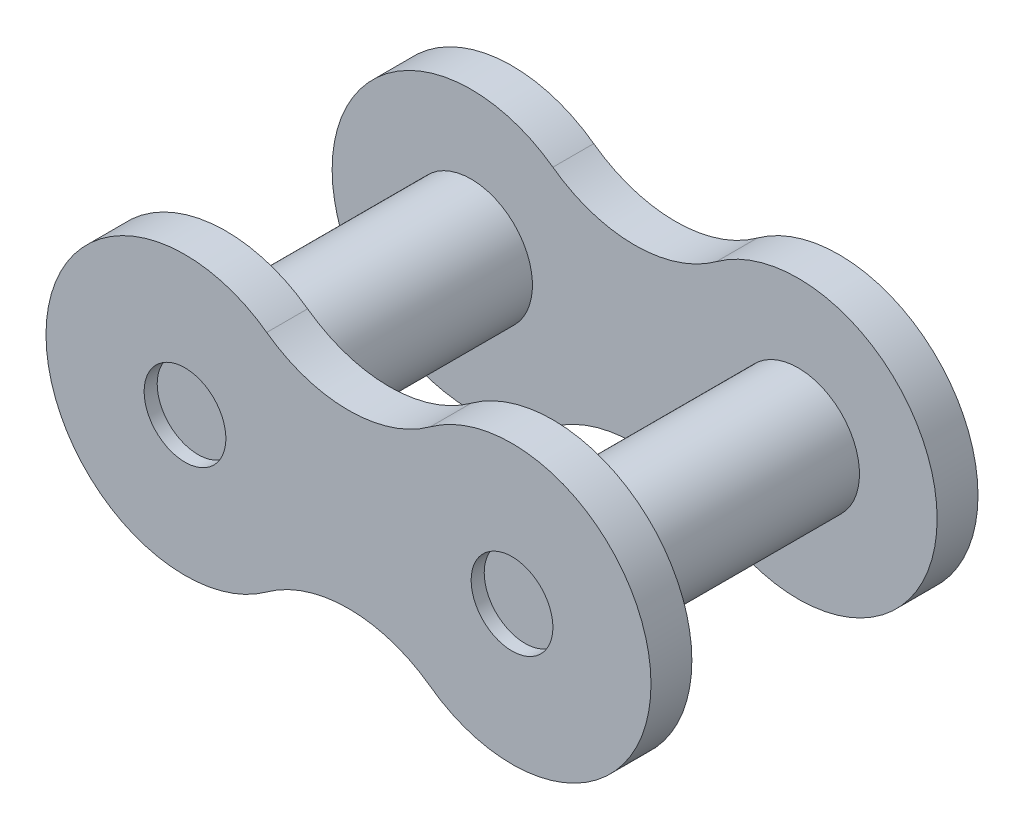
ISO-10303-21;
HEADER;
FILE_DESCRIPTION(('STEP AP214'),'2;1');
FILE_NAME('part.step','',(''),(''),'','','');
FILE_SCHEMA(('AUTOMOTIVE_DESIGN { 1 0 10303 214 1 1 1 1 }'));
ENDSEC;
DATA;
#1=APPLICATION_CONTEXT('core data for automotive mechanical design processes');
#2=APPLICATION_PROTOCOL_DEFINITION('international standard','automotive_design',2000,#1);
#3=PRODUCT_CONTEXT('',#1,'mechanical');
#4=PRODUCT('Part','Part','',(#3));
#5=PRODUCT_RELATED_PRODUCT_CATEGORY('part','',(#4));
#6=PRODUCT_DEFINITION_FORMATION('','',#4);
#7=PRODUCT_DEFINITION_CONTEXT('part definition',#1,'design');
#8=PRODUCT_DEFINITION('design','',#6,#7);
#9=PRODUCT_DEFINITION_SHAPE('','',#8);
#10=(LENGTH_UNIT() NAMED_UNIT(*) SI_UNIT(.MILLI.,.METRE.));
#11=(NAMED_UNIT(*) PLANE_ANGLE_UNIT() SI_UNIT($,.RADIAN.));
#12=(NAMED_UNIT(*) SI_UNIT($,.STERADIAN.) SOLID_ANGLE_UNIT());
#13=UNCERTAINTY_MEASURE_WITH_UNIT(LENGTH_MEASURE(1.E-05),#10,'distance_accuracy_value','');
#14=(GEOMETRIC_REPRESENTATION_CONTEXT(3) GLOBAL_UNCERTAINTY_ASSIGNED_CONTEXT((#13)) GLOBAL_UNIT_ASSIGNED_CONTEXT((#10,
#11,#12)) REPRESENTATION_CONTEXT('',''));
#15=CARTESIAN_POINT('',(0.,0.,0.));
#16=DIRECTION('',(0.,0.,1.));
#17=DIRECTION('',(1.,0.,0.));
#18=AXIS2_PLACEMENT_3D('',#15,#16,#17);
#19=CARTESIAN_POINT('',(9.525,-4.36490334944544,-0.79375));
#20=DIRECTION('',(0.,0.,1.));
#21=DIRECTION('',(1.,0.,0.));
#22=AXIS2_PLACEMENT_3D('',#19,#20,#21);
#23=CYLINDRICAL_SURFACE('',#22,2.69875);
#24=CARTESIAN_POINT('',(9.525,-4.36490334944544,0.));
#25=DIRECTION('',(0.,0.,-1.));
#26=DIRECTION('',(-1.,0.,0.));
#27=AXIS2_PLACEMENT_3D('',#24,#25,#26);
#28=CIRCLE('',#27,2.69875);
#29=CARTESIAN_POINT('',(11.1125,-2.18245167472272,0.));
#30=VERTEX_POINT('',#29);
#31=CARTESIAN_POINT('',(7.9375,-2.18245167472272,0.));
#32=VERTEX_POINT('',#31);
#33=EDGE_CURVE('E162',#30,#32,#28,.F.);
#34=ORIENTED_EDGE('',*,*,#33,.T.);
#35=DIRECTION('',(0.,0.,1.));
#36=VECTOR('',#35,1.);
#37=CARTESIAN_POINT('',(7.9375,-2.18245167472272,-0.79375));
#38=LINE('',#37,#36);
#39=CARTESIAN_POINT('',(7.9375,-2.18245167472272,-0.79375));
#40=VERTEX_POINT('',#39);
#41=EDGE_CURVE('E11',#40,#32,#38,.T.);
#42=ORIENTED_EDGE('',*,*,#41,.F.);
#43=CARTESIAN_POINT('',(9.525,-4.36490334944544,-0.79375));
#44=DIRECTION('',(0.,0.,-1.));
#45=DIRECTION('',(-1.,0.,0.));
#46=AXIS2_PLACEMENT_3D('',#43,#44,#45);
#47=CIRCLE('',#46,2.69875);
#48=CARTESIAN_POINT('',(11.1125,-2.18245167472272,-0.79375));
#49=VERTEX_POINT('',#48);
#50=EDGE_CURVE('E163',#49,#40,#47,.F.);
#51=ORIENTED_EDGE('',*,*,#50,.F.);
#52=DIRECTION('',(0.,0.,1.));
#53=VECTOR('',#52,1.);
#54=CARTESIAN_POINT('',(11.1125,-2.18245167472272,-0.79375));
#55=LINE('',#54,#53);
#56=EDGE_CURVE('E171',#49,#30,#55,.T.);
#57=ORIENTED_EDGE('',*,*,#56,.T.);
#58=EDGE_LOOP('',(#34,#42,#51,#57));
#59=FACE_BOUND('',#58,.T.);
#60=ADVANCED_FACE('F41',(#59),#23,.F.);
#61=CARTESIAN_POINT('',(6.35,0.,-0.79375));
#62=DIRECTION('',(0.,0.,1.));
#63=DIRECTION('',(1.,0.,0.));
#64=AXIS2_PLACEMENT_3D('',#61,#62,#63);
#65=CYLINDRICAL_SURFACE('',#64,2.69875);
#66=CARTESIAN_POINT('',(6.35,0.,0.));
#67=DIRECTION('',(0.,0.,-1.));
#68=DIRECTION('',(-1.,0.,0.));
#69=AXIS2_PLACEMENT_3D('',#66,#67,#68);
#70=CIRCLE('',#69,2.69875);
#71=CARTESIAN_POINT('',(7.9375,2.18245167472272,0.));
#72=VERTEX_POINT('',#71);
#73=EDGE_CURVE('E174',#32,#72,#70,.T.);
#74=ORIENTED_EDGE('',*,*,#73,.T.);
#75=DIRECTION('',(0.,0.,1.));
#76=VECTOR('',#75,1.);
#77=CARTESIAN_POINT('',(7.9375,2.18245167472272,-0.79375));
#78=LINE('',#77,#76);
#79=CARTESIAN_POINT('',(7.9375,2.18245167472272,-0.79375));
#80=VERTEX_POINT('',#79);
#81=EDGE_CURVE('E49',#80,#72,#78,.T.);
#82=ORIENTED_EDGE('',*,*,#81,.F.);
#83=CARTESIAN_POINT('',(6.35,0.,-0.79375));
#84=DIRECTION('',(0.,0.,-1.));
#85=DIRECTION('',(-1.,0.,0.));
#86=AXIS2_PLACEMENT_3D('',#83,#84,#85);
#87=CIRCLE('',#86,2.69875);
#88=EDGE_CURVE('E84',#40,#80,#87,.T.);
#89=ORIENTED_EDGE('',*,*,#88,.F.);
#90=ORIENTED_EDGE('',*,*,#41,.T.);
#91=EDGE_LOOP('',(#74,#82,#89,#90));
#92=FACE_BOUND('',#91,.T.);
#93=ADVANCED_FACE('F187',(#92),#65,.T.);
#94=CARTESIAN_POINT('',(9.525,4.36490334944544,-0.79375));
#95=DIRECTION('',(0.,0.,1.));
#96=DIRECTION('',(1.,0.,0.));
#97=AXIS2_PLACEMENT_3D('',#94,#95,#96);
#98=CYLINDRICAL_SURFACE('',#97,2.69875);
#99=CARTESIAN_POINT('',(9.525,4.36490334944544,0.));
#100=DIRECTION('',(0.,0.,-1.));
#101=DIRECTION('',(-1.,0.,0.));
#102=AXIS2_PLACEMENT_3D('',#99,#100,#101);
#103=CIRCLE('',#102,2.69875);
#104=CARTESIAN_POINT('',(11.1125,2.18245167472272,0.));
#105=VERTEX_POINT('',#104);
#106=EDGE_CURVE('E177',#105,#72,#103,.T.);
#107=ORIENTED_EDGE('',*,*,#106,.F.);
#108=DIRECTION('',(0.,0.,1.));
#109=VECTOR('',#108,1.);
#110=CARTESIAN_POINT('',(11.1125,2.18245167472272,-0.79375));
#111=LINE('',#110,#109);
#112=CARTESIAN_POINT('',(11.1125,2.18245167472272,-0.79375));
#113=VERTEX_POINT('',#112);
#114=EDGE_CURVE('E74',#113,#105,#111,.T.);
#115=ORIENTED_EDGE('',*,*,#114,.F.);
#116=CARTESIAN_POINT('',(9.525,4.36490334944544,-0.79375));
#117=DIRECTION('',(0.,0.,-1.));
#118=DIRECTION('',(-1.,0.,0.));
#119=AXIS2_PLACEMENT_3D('',#116,#117,#118);
#120=CIRCLE('',#119,2.69875);
#121=EDGE_CURVE('E167',#113,#80,#120,.T.);
#122=ORIENTED_EDGE('',*,*,#121,.T.);
#123=ORIENTED_EDGE('',*,*,#81,.T.);
#124=EDGE_LOOP('',(#107,#115,#122,#123));
#125=FACE_BOUND('',#124,.T.);
#126=ADVANCED_FACE('F186',(#125),#98,.F.);
#127=CARTESIAN_POINT('',(12.7,0.,-0.79375));
#128=DIRECTION('',(0.,0.,1.));
#129=DIRECTION('',(1.,0.,0.));
#130=AXIS2_PLACEMENT_3D('',#127,#128,#129);
#131=CYLINDRICAL_SURFACE('',#130,2.69875);
#132=CARTESIAN_POINT('',(12.7,0.,0.));
#133=DIRECTION('',(0.,0.,-1.));
#134=DIRECTION('',(-1.,0.,0.));
#135=AXIS2_PLACEMENT_3D('',#132,#133,#134);
#136=CIRCLE('',#135,2.69875);
#137=EDGE_CURVE('E77',#105,#30,#136,.T.);
#138=ORIENTED_EDGE('',*,*,#137,.T.);
#139=ORIENTED_EDGE('',*,*,#56,.F.);
#140=CARTESIAN_POINT('',(12.7,0.,-0.79375));
#141=DIRECTION('',(0.,0.,-1.));
#142=DIRECTION('',(-1.,0.,0.));
#143=AXIS2_PLACEMENT_3D('',#140,#141,#142);
#144=CIRCLE('',#143,2.69875);
#145=EDGE_CURVE('E57',#113,#49,#144,.T.);
#146=ORIENTED_EDGE('',*,*,#145,.F.);
#147=ORIENTED_EDGE('',*,*,#114,.T.);
#148=EDGE_LOOP('',(#138,#139,#146,#147));
#149=FACE_BOUND('',#148,.T.);
#150=ADVANCED_FACE('F195',(#149),#131,.T.);
#151=CARTESIAN_POINT('',(0.,0.,-0.79375));
#152=DIRECTION('',(0.,0.,-1.));
#153=DIRECTION('',(-1.,0.,0.));
#154=AXIS2_PLACEMENT_3D('',#151,#152,#153);
#155=PLANE('',#154);
#156=CARTESIAN_POINT('',(12.7,0.,-0.79375));
#157=DIRECTION('',(0.,0.,-1.));
#158=DIRECTION('',(-1.,0.,0.));
#159=AXIS2_PLACEMENT_3D('',#156,#157,#158);
#160=CIRCLE('',#159,0.793749999999999);
#161=CARTESIAN_POINT('',(11.90625,0.,-0.79375));
#162=VERTEX_POINT('',#161);
#163=EDGE_CURVE('E486',#162,#162,#160,.T.);
#164=ORIENTED_EDGE('',*,*,#163,.F.);
#165=EDGE_LOOP('',(#164));
#166=FACE_BOUND('',#165,.T.);
#167=CARTESIAN_POINT('',(6.35,0.,-0.79375));
#168=DIRECTION('',(0.,0.,-1.));
#169=DIRECTION('',(-1.,0.,0.));
#170=AXIS2_PLACEMENT_3D('',#167,#168,#169);
#171=CIRCLE('',#170,0.79375);
#172=CARTESIAN_POINT('',(5.55625,0.,-0.79375));
#173=VERTEX_POINT('',#172);
#174=EDGE_CURVE('E469',#173,#173,#171,.T.);
#175=ORIENTED_EDGE('',*,*,#174,.F.);
#176=EDGE_LOOP('',(#175));
#177=FACE_BOUND('',#176,.T.);
#178=ORIENTED_EDGE('',*,*,#50,.T.);
#179=ORIENTED_EDGE('',*,*,#88,.T.);
#180=ORIENTED_EDGE('',*,*,#121,.F.);
#181=ORIENTED_EDGE('',*,*,#145,.T.);
#182=EDGE_LOOP('',(#178,#179,#180,#181));
#183=FACE_BOUND('',#182,.T.);
#184=ADVANCED_FACE('F196',(#166,#177,#183),#155,.T.);
#185=CARTESIAN_POINT('',(0.,0.,0.));
#186=DIRECTION('',(0.,0.,-1.));
#187=DIRECTION('',(-1.,0.,0.));
#188=AXIS2_PLACEMENT_3D('',#185,#186,#187);
#189=PLANE('',#188);
#190=ORIENTED_EDGE('',*,*,#33,.F.);
#191=ORIENTED_EDGE('',*,*,#137,.F.);
#192=ORIENTED_EDGE('',*,*,#106,.T.);
#193=ORIENTED_EDGE('',*,*,#73,.F.);
#194=EDGE_LOOP('',(#190,#191,#192,#193));
#195=FACE_BOUND('',#194,.T.);
#196=CARTESIAN_POINT('',(12.7,0.,0.));
#197=DIRECTION('',(0.,0.,-1.));
#198=DIRECTION('',(-1.,0.,0.));
#199=AXIS2_PLACEMENT_3D('',#196,#197,#198);
#200=CIRCLE('',#199,1.190625);
#201=CARTESIAN_POINT('',(11.509375,0.,0.));
#202=VERTEX_POINT('',#201);
#203=EDGE_CURVE('E131',#202,#202,#200,.T.);
#204=ORIENTED_EDGE('',*,*,#203,.T.);
#205=EDGE_LOOP('',(#204));
#206=FACE_BOUND('',#205,.T.);
#207=CARTESIAN_POINT('',(6.35,0.,0.));
#208=DIRECTION('',(0.,0.,-1.));
#209=DIRECTION('',(-1.,0.,0.));
#210=AXIS2_PLACEMENT_3D('',#207,#208,#209);
#211=CIRCLE('',#210,1.190625);
#212=CARTESIAN_POINT('',(5.159375,0.,0.));
#213=VERTEX_POINT('',#212);
#214=EDGE_CURVE('E165',#213,#213,#211,.F.);
#215=ORIENTED_EDGE('',*,*,#214,.F.);
#216=EDGE_LOOP('',(#215));
#217=FACE_BOUND('',#216,.T.);
#218=ADVANCED_FACE('F191',(#195,#206,#217),#189,.F.);
#219=CARTESIAN_POINT('',(6.35,0.,2.38125));
#220=DIRECTION('',(0.,0.,-1.));
#221=DIRECTION('',(-1.,0.,0.));
#222=AXIS2_PLACEMENT_3D('',#219,#220,#221);
#223=CYLINDRICAL_SURFACE('',#222,1.190625);
#224=ORIENTED_EDGE('',*,*,#214,.T.);
#225=EDGE_LOOP('',(#224));
#226=FACE_BOUND('',#225,.T.);
#227=CARTESIAN_POINT('',(6.35,0.,4.7625));
#228=DIRECTION('',(0.,0.,-1.));
#229=DIRECTION('',(-1.,0.,0.));
#230=AXIS2_PLACEMENT_3D('',#227,#228,#229);
#231=CIRCLE('',#230,1.190625);
#232=CARTESIAN_POINT('',(5.159375,0.,4.7625));
#233=VERTEX_POINT('',#232);
#234=EDGE_CURVE('E137',#233,#233,#231,.F.);
#235=ORIENTED_EDGE('',*,*,#234,.F.);
#236=EDGE_LOOP('',(#235));
#237=FACE_BOUND('',#236,.T.);
#238=ADVANCED_FACE('F205',(#226,#237),#223,.T.);
#239=CARTESIAN_POINT('',(12.7,0.,2.38125));
#240=DIRECTION('',(0.,0.,-1.));
#241=DIRECTION('',(-1.,0.,0.));
#242=AXIS2_PLACEMENT_3D('',#239,#240,#241);
#243=CYLINDRICAL_SURFACE('',#242,1.190625);
#244=ORIENTED_EDGE('',*,*,#203,.F.);
#245=EDGE_LOOP('',(#244));
#246=FACE_BOUND('',#245,.T.);
#247=CARTESIAN_POINT('',(12.7,0.,4.7625));
#248=DIRECTION('',(0.,0.,-1.));
#249=DIRECTION('',(-1.,0.,0.));
#250=AXIS2_PLACEMENT_3D('',#247,#248,#249);
#251=CIRCLE('',#250,1.190625);
#252=CARTESIAN_POINT('',(11.509375,0.,4.7625));
#253=VERTEX_POINT('',#252);
#254=EDGE_CURVE('E143',#253,#253,#251,.T.);
#255=ORIENTED_EDGE('',*,*,#254,.T.);
#256=EDGE_LOOP('',(#255));
#257=FACE_BOUND('',#256,.T.);
#258=ADVANCED_FACE('F255',(#246,#257),#243,.T.);
#259=CARTESIAN_POINT('',(9.525,-4.36490334944544,5.55625));
#260=DIRECTION('',(0.,0.,-1.));
#261=DIRECTION('',(1.,0.,0.));
#262=AXIS2_PLACEMENT_3D('',#259,#260,#261);
#263=CYLINDRICAL_SURFACE('',#262,2.69875);
#264=CARTESIAN_POINT('',(9.525,-4.36490334944544,4.7625));
#265=DIRECTION('',(0.,0.,-1.));
#266=DIRECTION('',(-1.,0.,0.));
#267=AXIS2_PLACEMENT_3D('',#264,#265,#266);
#268=CIRCLE('',#267,2.69875);
#269=CARTESIAN_POINT('',(11.1125,-2.18245167472272,4.7625));
#270=VERTEX_POINT('',#269);
#271=CARTESIAN_POINT('',(7.9375,-2.18245167472272,4.7625));
#272=VERTEX_POINT('',#271);
#273=EDGE_CURVE('E149',#270,#272,#268,.F.);
#274=ORIENTED_EDGE('',*,*,#273,.F.);
#275=DIRECTION('',(0.,0.,-1.));
#276=VECTOR('',#275,1.);
#277=CARTESIAN_POINT('',(11.1125,-2.18245167472272,5.55625));
#278=LINE('',#277,#276);
#279=CARTESIAN_POINT('',(11.1125,-2.18245167472272,5.55625));
#280=VERTEX_POINT('',#279);
#281=EDGE_CURVE('E136',#280,#270,#278,.T.);
#282=ORIENTED_EDGE('',*,*,#281,.F.);
#283=CARTESIAN_POINT('',(9.525,-4.36490334944544,5.55625));
#284=DIRECTION('',(0.,0.,-1.));
#285=DIRECTION('',(-1.,0.,0.));
#286=AXIS2_PLACEMENT_3D('',#283,#284,#285);
#287=CIRCLE('',#286,2.69875);
#288=CARTESIAN_POINT('',(7.9375,-2.18245167472272,5.55625));
#289=VERTEX_POINT('',#288);
#290=EDGE_CURVE('E115',#280,#289,#287,.F.);
#291=ORIENTED_EDGE('',*,*,#290,.T.);
#292=DIRECTION('',(0.,0.,-1.));
#293=VECTOR('',#292,1.);
#294=CARTESIAN_POINT('',(7.9375,-2.18245167472272,5.55625));
#295=LINE('',#294,#293);
#296=EDGE_CURVE('E124',#289,#272,#295,.T.);
#297=ORIENTED_EDGE('',*,*,#296,.T.);
#298=EDGE_LOOP('',(#274,#282,#291,#297));
#299=FACE_BOUND('',#298,.T.);
#300=ADVANCED_FACE('F134',(#299),#263,.F.);
#301=CARTESIAN_POINT('',(6.35,0.,5.55625));
#302=DIRECTION('',(0.,0.,-1.));
#303=DIRECTION('',(1.,0.,0.));
#304=AXIS2_PLACEMENT_3D('',#301,#302,#303);
#305=CYLINDRICAL_SURFACE('',#304,2.69875);
#306=CARTESIAN_POINT('',(6.35,0.,4.7625));
#307=DIRECTION('',(0.,0.,-1.));
#308=DIRECTION('',(-1.,0.,0.));
#309=AXIS2_PLACEMENT_3D('',#306,#307,#308);
#310=CIRCLE('',#309,2.69875);
#311=CARTESIAN_POINT('',(7.9375,2.18245167472272,4.7625));
#312=VERTEX_POINT('',#311);
#313=EDGE_CURVE('E127',#272,#312,#310,.T.);
#314=ORIENTED_EDGE('',*,*,#313,.F.);
#315=ORIENTED_EDGE('',*,*,#296,.F.);
#316=CARTESIAN_POINT('',(6.35,0.,5.55625));
#317=DIRECTION('',(0.,0.,-1.));
#318=DIRECTION('',(-1.,0.,0.));
#319=AXIS2_PLACEMENT_3D('',#316,#317,#318);
#320=CIRCLE('',#319,2.69875);
#321=CARTESIAN_POINT('',(7.9375,2.18245167472272,5.55625));
#322=VERTEX_POINT('',#321);
#323=EDGE_CURVE('E111',#289,#322,#320,.T.);
#324=ORIENTED_EDGE('',*,*,#323,.T.);
#325=DIRECTION('',(0.,0.,-1.));
#326=VECTOR('',#325,1.);
#327=CARTESIAN_POINT('',(7.9375,2.18245167472272,5.55625));
#328=LINE('',#327,#326);
#329=EDGE_CURVE('E132',#322,#312,#328,.T.);
#330=ORIENTED_EDGE('',*,*,#329,.T.);
#331=EDGE_LOOP('',(#314,#315,#324,#330));
#332=FACE_BOUND('',#331,.T.);
#333=ADVANCED_FACE('F125',(#332),#305,.T.);
#334=CARTESIAN_POINT('',(9.525,4.36490334944544,5.55625));
#335=DIRECTION('',(0.,0.,-1.));
#336=DIRECTION('',(1.,0.,0.));
#337=AXIS2_PLACEMENT_3D('',#334,#335,#336);
#338=CYLINDRICAL_SURFACE('',#337,2.69875);
#339=CARTESIAN_POINT('',(9.525,4.36490334944544,4.7625));
#340=DIRECTION('',(0.,0.,-1.));
#341=DIRECTION('',(-1.,0.,0.));
#342=AXIS2_PLACEMENT_3D('',#339,#340,#341);
#343=CIRCLE('',#342,2.69875);
#344=CARTESIAN_POINT('',(11.1125,2.18245167472272,4.7625));
#345=VERTEX_POINT('',#344);
#346=EDGE_CURVE('E152',#345,#312,#343,.T.);
#347=ORIENTED_EDGE('',*,*,#346,.T.);
#348=ORIENTED_EDGE('',*,*,#329,.F.);
#349=CARTESIAN_POINT('',(9.525,4.36490334944544,5.55625));
#350=DIRECTION('',(0.,0.,-1.));
#351=DIRECTION('',(-1.,0.,0.));
#352=AXIS2_PLACEMENT_3D('',#349,#350,#351);
#353=CIRCLE('',#352,2.69875);
#354=CARTESIAN_POINT('',(11.1125,2.18245167472272,5.55625));
#355=VERTEX_POINT('',#354);
#356=EDGE_CURVE('E118',#355,#322,#353,.T.);
#357=ORIENTED_EDGE('',*,*,#356,.F.);
#358=DIRECTION('',(0.,0.,-1.));
#359=VECTOR('',#358,1.);
#360=CARTESIAN_POINT('',(11.1125,2.18245167472272,5.55625));
#361=LINE('',#360,#359);
#362=EDGE_CURVE('E156',#355,#345,#361,.T.);
#363=ORIENTED_EDGE('',*,*,#362,.T.);
#364=EDGE_LOOP('',(#347,#348,#357,#363));
#365=FACE_BOUND('',#364,.T.);
#366=ADVANCED_FACE('F286',(#365),#338,.F.);
#367=CARTESIAN_POINT('',(12.7,0.,5.55625));
#368=DIRECTION('',(0.,0.,-1.));
#369=DIRECTION('',(1.,0.,0.));
#370=AXIS2_PLACEMENT_3D('',#367,#368,#369);
#371=CYLINDRICAL_SURFACE('',#370,2.69875);
#372=CARTESIAN_POINT('',(12.7,0.,4.7625));
#373=DIRECTION('',(0.,0.,-1.));
#374=DIRECTION('',(-1.,0.,0.));
#375=AXIS2_PLACEMENT_3D('',#372,#373,#374);
#376=CIRCLE('',#375,2.69875);
#377=EDGE_CURVE('E140',#345,#270,#376,.T.);
#378=ORIENTED_EDGE('',*,*,#377,.F.);
#379=ORIENTED_EDGE('',*,*,#362,.F.);
#380=CARTESIAN_POINT('',(12.7,0.,5.55625));
#381=DIRECTION('',(0.,0.,-1.));
#382=DIRECTION('',(-1.,0.,0.));
#383=AXIS2_PLACEMENT_3D('',#380,#381,#382);
#384=CIRCLE('',#383,2.69875);
#385=EDGE_CURVE('E147',#355,#280,#384,.T.);
#386=ORIENTED_EDGE('',*,*,#385,.T.);
#387=ORIENTED_EDGE('',*,*,#281,.T.);
#388=EDGE_LOOP('',(#378,#379,#386,#387));
#389=FACE_BOUND('',#388,.T.);
#390=ADVANCED_FACE('F296',(#389),#371,.T.);
#391=CARTESIAN_POINT('',(0.,0.,5.55625));
#392=DIRECTION('',(0.,0.,1.));
#393=DIRECTION('',(-1.,0.,0.));
#394=AXIS2_PLACEMENT_3D('',#391,#392,#393);
#395=PLANE('',#394);
#396=CARTESIAN_POINT('',(12.7,0.,5.55625));
#397=DIRECTION('',(0.,0.,-1.));
#398=DIRECTION('',(-1.,0.,0.));
#399=AXIS2_PLACEMENT_3D('',#396,#397,#398);
#400=CIRCLE('',#399,0.793749999999999);
#401=CARTESIAN_POINT('',(11.90625,0.,5.55625));
#402=VERTEX_POINT('',#401);
#403=EDGE_CURVE('E470',#402,#402,#400,.T.);
#404=ORIENTED_EDGE('',*,*,#403,.T.);
#405=EDGE_LOOP('',(#404));
#406=FACE_BOUND('',#405,.T.);
#407=CARTESIAN_POINT('',(6.35,0.,5.55625));
#408=DIRECTION('',(0.,0.,-1.));
#409=DIRECTION('',(-1.,0.,0.));
#410=AXIS2_PLACEMENT_3D('',#407,#408,#409);
#411=CIRCLE('',#410,0.79375);
#412=CARTESIAN_POINT('',(5.55625,0.,5.55625));
#413=VERTEX_POINT('',#412);
#414=EDGE_CURVE('E480',#413,#413,#411,.T.);
#415=ORIENTED_EDGE('',*,*,#414,.T.);
#416=EDGE_LOOP('',(#415));
#417=FACE_BOUND('',#416,.T.);
#418=ORIENTED_EDGE('',*,*,#290,.F.);
#419=ORIENTED_EDGE('',*,*,#385,.F.);
#420=ORIENTED_EDGE('',*,*,#356,.T.);
#421=ORIENTED_EDGE('',*,*,#323,.F.);
#422=EDGE_LOOP('',(#418,#419,#420,#421));
#423=FACE_BOUND('',#422,.T.);
#424=ADVANCED_FACE('F113',(#406,#417,#423),#395,.T.);
#425=CARTESIAN_POINT('',(0.,0.,4.7625));
#426=DIRECTION('',(0.,0.,1.));
#427=DIRECTION('',(-1.,0.,0.));
#428=AXIS2_PLACEMENT_3D('',#425,#426,#427);
#429=PLANE('',#428);
#430=ORIENTED_EDGE('',*,*,#273,.T.);
#431=ORIENTED_EDGE('',*,*,#313,.T.);
#432=ORIENTED_EDGE('',*,*,#346,.F.);
#433=ORIENTED_EDGE('',*,*,#377,.T.);
#434=EDGE_LOOP('',(#430,#431,#432,#433));
#435=FACE_BOUND('',#434,.T.);
#436=ORIENTED_EDGE('',*,*,#254,.F.);
#437=EDGE_LOOP('',(#436));
#438=FACE_BOUND('',#437,.T.);
#439=ORIENTED_EDGE('',*,*,#234,.T.);
#440=EDGE_LOOP('',(#439));
#441=FACE_BOUND('',#440,.T.);
#442=ADVANCED_FACE('F317',(#435,#438,#441),#429,.F.);
#443=CARTESIAN_POINT('',(6.35,0.,-0.53975));
#444=DIRECTION('',(0.,0.,-1.));
#445=DIRECTION('',(-1.,0.,0.));
#446=AXIS2_PLACEMENT_3D('',#443,#444,#445);
#447=CYLINDRICAL_SURFACE('',#446,0.79375);
#448=CARTESIAN_POINT('',(6.35,0.,-0.53975));
#449=DIRECTION('',(0.,0.,-1.));
#450=DIRECTION('',(-1.,0.,0.));
#451=AXIS2_PLACEMENT_3D('',#448,#449,#450);
#452=CIRCLE('',#451,0.79375);
#453=CARTESIAN_POINT('',(5.55625,0.,-0.53975));
#454=VERTEX_POINT('',#453);
#455=EDGE_CURVE('E473',#454,#454,#452,.T.);
#456=ORIENTED_EDGE('',*,*,#455,.F.);
#457=EDGE_LOOP('',(#456));
#458=FACE_BOUND('',#457,.T.);
#459=ORIENTED_EDGE('',*,*,#174,.T.);
#460=EDGE_LOOP('',(#459));
#461=FACE_BOUND('',#460,.T.);
#462=ADVANCED_FACE('F327',(#458,#461),#447,.F.);
#463=CARTESIAN_POINT('',(6.35,0.,-0.53975));
#464=DIRECTION('',(0.,0.,-1.));
#465=DIRECTION('',(-1.,0.,0.));
#466=AXIS2_PLACEMENT_3D('',#463,#464,#465);
#467=PLANE('',#466);
#468=ORIENTED_EDGE('',*,*,#455,.T.);
#469=EDGE_LOOP('',(#468));
#470=FACE_BOUND('',#469,.T.);
#471=ADVANCED_FACE('F357',(#470),#467,.T.);
#472=CARTESIAN_POINT('',(12.7,0.,-0.53975));
#473=DIRECTION('',(0.,0.,-1.));
#474=DIRECTION('',(-1.,0.,0.));
#475=AXIS2_PLACEMENT_3D('',#472,#473,#474);
#476=CYLINDRICAL_SURFACE('',#475,0.793749999999999);
#477=CARTESIAN_POINT('',(12.7,0.,-0.53975));
#478=DIRECTION('',(0.,0.,-1.));
#479=DIRECTION('',(-1.,0.,0.));
#480=AXIS2_PLACEMENT_3D('',#477,#478,#479);
#481=CIRCLE('',#480,0.793749999999999);
#482=CARTESIAN_POINT('',(11.90625,0.,-0.53975));
#483=VERTEX_POINT('',#482);
#484=EDGE_CURVE('E483',#483,#483,#481,.T.);
#485=ORIENTED_EDGE('',*,*,#484,.F.);
#486=EDGE_LOOP('',(#485));
#487=FACE_BOUND('',#486,.T.);
#488=ORIENTED_EDGE('',*,*,#163,.T.);
#489=EDGE_LOOP('',(#488));
#490=FACE_BOUND('',#489,.T.);
#491=ADVANCED_FACE('F365',(#487,#490),#476,.F.);
#492=CARTESIAN_POINT('',(12.7,0.,-0.53975));
#493=DIRECTION('',(0.,0.,-1.));
#494=DIRECTION('',(-1.,0.,0.));
#495=AXIS2_PLACEMENT_3D('',#492,#493,#494);
#496=PLANE('',#495);
#497=ORIENTED_EDGE('',*,*,#484,.T.);
#498=EDGE_LOOP('',(#497));
#499=FACE_BOUND('',#498,.T.);
#500=ADVANCED_FACE('F373',(#499),#496,.T.);
#501=CARTESIAN_POINT('',(6.35,0.,5.30225));
#502=DIRECTION('',(0.,0.,1.));
#503=DIRECTION('',(1.,0.,0.));
#504=AXIS2_PLACEMENT_3D('',#501,#502,#503);
#505=CYLINDRICAL_SURFACE('',#504,0.79375);
#506=CARTESIAN_POINT('',(6.35,0.,5.30225));
#507=DIRECTION('',(0.,0.,-1.));
#508=DIRECTION('',(-1.,0.,0.));
#509=AXIS2_PLACEMENT_3D('',#506,#507,#508);
#510=CIRCLE('',#509,0.79375);
#511=CARTESIAN_POINT('',(5.55625,0.,5.30225));
#512=VERTEX_POINT('',#511);
#513=EDGE_CURVE('E475',#512,#512,#510,.T.);
#514=ORIENTED_EDGE('',*,*,#513,.T.);
#515=EDGE_LOOP('',(#514));
#516=FACE_BOUND('',#515,.T.);
#517=ORIENTED_EDGE('',*,*,#414,.F.);
#518=EDGE_LOOP('',(#517));
#519=FACE_BOUND('',#518,.T.);
#520=ADVANCED_FACE('F380',(#516,#519),#505,.F.);
#521=CARTESIAN_POINT('',(6.35,0.,5.30225));
#522=DIRECTION('',(0.,0.,1.));
#523=DIRECTION('',(-1.,0.,0.));
#524=AXIS2_PLACEMENT_3D('',#521,#522,#523);
#525=PLANE('',#524);
#526=ORIENTED_EDGE('',*,*,#513,.F.);
#527=EDGE_LOOP('',(#526));
#528=FACE_BOUND('',#527,.T.);
#529=ADVANCED_FACE('F387',(#528),#525,.T.);
#530=CARTESIAN_POINT('',(12.7,0.,5.30225));
#531=DIRECTION('',(0.,0.,1.));
#532=DIRECTION('',(1.,0.,0.));
#533=AXIS2_PLACEMENT_3D('',#530,#531,#532);
#534=CYLINDRICAL_SURFACE('',#533,0.793749999999999);
#535=CARTESIAN_POINT('',(12.7,0.,5.30225));
#536=DIRECTION('',(0.,0.,-1.));
#537=DIRECTION('',(-1.,0.,0.));
#538=AXIS2_PLACEMENT_3D('',#535,#536,#537);
#539=CIRCLE('',#538,0.793749999999999);
#540=CARTESIAN_POINT('',(11.90625,0.,5.30225));
#541=VERTEX_POINT('',#540);
#542=EDGE_CURVE('E468',#541,#541,#539,.T.);
#543=ORIENTED_EDGE('',*,*,#542,.T.);
#544=EDGE_LOOP('',(#543));
#545=FACE_BOUND('',#544,.T.);
#546=ORIENTED_EDGE('',*,*,#403,.F.);
#547=EDGE_LOOP('',(#546));
#548=FACE_BOUND('',#547,.T.);
#549=ADVANCED_FACE('F395',(#545,#548),#534,.F.);
#550=CARTESIAN_POINT('',(12.7,0.,5.30225));
#551=DIRECTION('',(0.,0.,1.));
#552=DIRECTION('',(-1.,0.,0.));
#553=AXIS2_PLACEMENT_3D('',#550,#551,#552);
#554=PLANE('',#553);
#555=ORIENTED_EDGE('',*,*,#542,.F.);
#556=EDGE_LOOP('',(#555));
#557=FACE_BOUND('',#556,.T.);
#558=ADVANCED_FACE('F403',(#557),#554,.T.);
#559=CLOSED_SHELL('',(#60,#93,#126,#150,#184,#218,#238,#258,#300,#333,#366,#390,#424,#442,#462,
#471,#491,#500,#520,#529,#549,#558));
#560=MANIFOLD_SOLID_BREP('B2',#559);
#561=ADVANCED_BREP_SHAPE_REPRESENTATION('',(#18,#560),#14);
#562=SHAPE_DEFINITION_REPRESENTATION(#9,#561);
ENDSEC;
END-ISO-10303-21;
